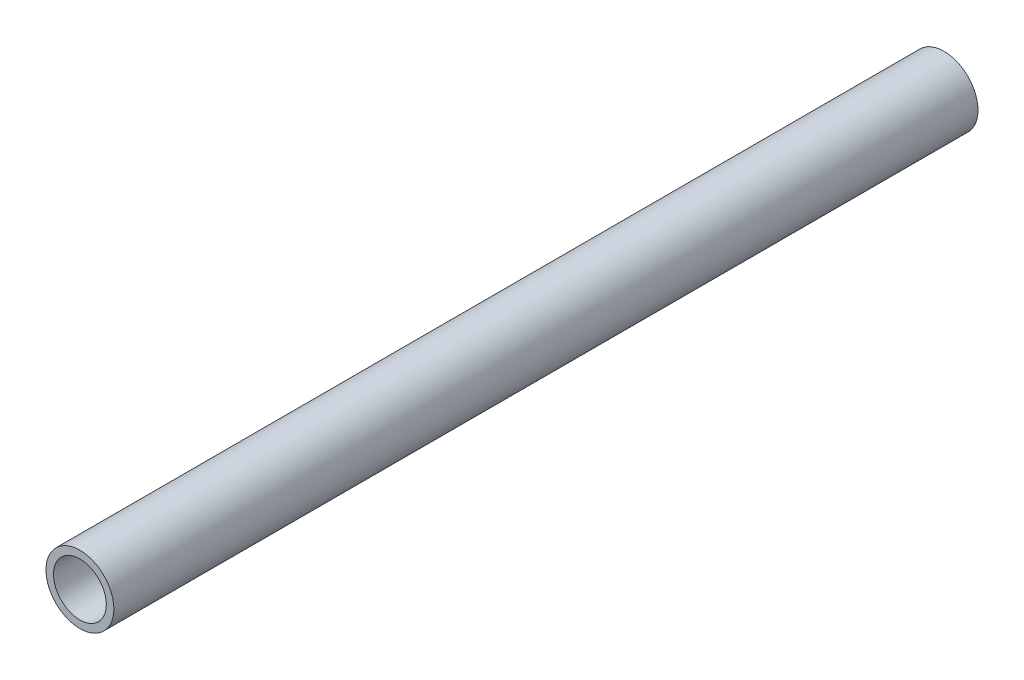
ISO-10303-21;
HEADER;
FILE_DESCRIPTION(('STEP AP214'),'2;1');
FILE_NAME('part.step','',(''),(''),'','','');
FILE_SCHEMA(('AUTOMOTIVE_DESIGN { 1 0 10303 214 1 1 1 1 }'));
ENDSEC;
DATA;
#1=APPLICATION_CONTEXT('core data for automotive mechanical design processes');
#2=APPLICATION_PROTOCOL_DEFINITION('international standard','automotive_design',2000,#1);
#3=PRODUCT_CONTEXT('',#1,'mechanical');
#4=PRODUCT('Part','Part','',(#3));
#5=PRODUCT_RELATED_PRODUCT_CATEGORY('part','',(#4));
#6=PRODUCT_DEFINITION_FORMATION('','',#4);
#7=PRODUCT_DEFINITION_CONTEXT('part definition',#1,'design');
#8=PRODUCT_DEFINITION('design','',#6,#7);
#9=PRODUCT_DEFINITION_SHAPE('','',#8);
#10=(LENGTH_UNIT() NAMED_UNIT(*) SI_UNIT(.MILLI.,.METRE.));
#11=(NAMED_UNIT(*) PLANE_ANGLE_UNIT() SI_UNIT($,.RADIAN.));
#12=(NAMED_UNIT(*) SI_UNIT($,.STERADIAN.) SOLID_ANGLE_UNIT());
#13=UNCERTAINTY_MEASURE_WITH_UNIT(LENGTH_MEASURE(1.E-05),#10,'distance_accuracy_value','');
#14=(GEOMETRIC_REPRESENTATION_CONTEXT(3) GLOBAL_UNCERTAINTY_ASSIGNED_CONTEXT((#13)) GLOBAL_UNIT_ASSIGNED_CONTEXT((#10,
#11,#12)) REPRESENTATION_CONTEXT('',''));
#15=CARTESIAN_POINT('',(0.,0.,0.));
#16=DIRECTION('',(0.,0.,1.));
#17=DIRECTION('',(1.,0.,0.));
#18=AXIS2_PLACEMENT_3D('',#15,#16,#17);
#19=CARTESIAN_POINT('',(0.,0.,229.04));
#20=DIRECTION('',(0.,0.,1.));
#21=DIRECTION('',(1.,0.,0.));
#22=AXIS2_PLACEMENT_3D('',#19,#20,#21);
#23=PLANE('',#22);
#24=CARTESIAN_POINT('',(0.,0.,229.04));
#25=DIRECTION('',(0.,0.,1.));
#26=DIRECTION('',(1.,0.,0.));
#27=AXIS2_PLACEMENT_3D('',#24,#25,#26);
#28=CIRCLE('',#27,9.);
#29=CARTESIAN_POINT('',(9.,0.,229.04));
#30=VERTEX_POINT('',#29);
#31=EDGE_CURVE('E10',#30,#30,#28,.T.);
#32=ORIENTED_EDGE('',*,*,#31,.T.);
#33=EDGE_LOOP('',(#32));
#34=FACE_BOUND('',#33,.T.);
#35=CARTESIAN_POINT('',(0.,0.,229.04));
#36=DIRECTION('',(0.,0.,1.));
#37=DIRECTION('',(1.,0.,0.));
#38=AXIS2_PLACEMENT_3D('',#35,#36,#37);
#39=CIRCLE('',#38,7.);
#40=CARTESIAN_POINT('',(7.,0.,229.04));
#41=VERTEX_POINT('',#40);
#42=EDGE_CURVE('E44',#41,#41,#39,.T.);
#43=ORIENTED_EDGE('',*,*,#42,.F.);
#44=EDGE_LOOP('',(#43));
#45=FACE_BOUND('',#44,.T.);
#46=ADVANCED_FACE('F33',(#34,#45),#23,.T.);
#47=CARTESIAN_POINT('',(0.,0.,0.));
#48=DIRECTION('',(0.,0.,1.));
#49=DIRECTION('',(1.,0.,0.));
#50=AXIS2_PLACEMENT_3D('',#47,#48,#49);
#51=PLANE('',#50);
#52=CARTESIAN_POINT('',(0.,0.,0.));
#53=DIRECTION('',(0.,0.,1.));
#54=DIRECTION('',(1.,0.,0.));
#55=AXIS2_PLACEMENT_3D('',#52,#53,#54);
#56=CIRCLE('',#55,9.);
#57=CARTESIAN_POINT('',(9.,0.,0.));
#58=VERTEX_POINT('',#57);
#59=EDGE_CURVE('E37',#58,#58,#56,.T.);
#60=ORIENTED_EDGE('',*,*,#59,.F.);
#61=EDGE_LOOP('',(#60));
#62=FACE_BOUND('',#61,.T.);
#63=CARTESIAN_POINT('',(0.,0.,0.));
#64=DIRECTION('',(0.,0.,1.));
#65=DIRECTION('',(1.,0.,0.));
#66=AXIS2_PLACEMENT_3D('',#63,#64,#65);
#67=CIRCLE('',#66,7.);
#68=CARTESIAN_POINT('',(7.,0.,0.));
#69=VERTEX_POINT('',#68);
#70=EDGE_CURVE('E46',#69,#69,#67,.T.);
#71=ORIENTED_EDGE('',*,*,#70,.T.);
#72=EDGE_LOOP('',(#71));
#73=FACE_BOUND('',#72,.T.);
#74=ADVANCED_FACE('F56',(#62,#73),#51,.F.);
#75=CARTESIAN_POINT('',(0.,0.,229.04));
#76=DIRECTION('',(0.,0.,-1.));
#77=DIRECTION('',(-1.,0.,0.));
#78=AXIS2_PLACEMENT_3D('',#75,#76,#77);
#79=CYLINDRICAL_SURFACE('',#78,9.);
#80=ORIENTED_EDGE('',*,*,#31,.F.);
#81=EDGE_LOOP('',(#80));
#82=FACE_BOUND('',#81,.T.);
#83=ORIENTED_EDGE('',*,*,#59,.T.);
#84=EDGE_LOOP('',(#83));
#85=FACE_BOUND('',#84,.T.);
#86=ADVANCED_FACE('F35',(#82,#85),#79,.T.);
#87=CARTESIAN_POINT('',(0.,0.,229.04));
#88=DIRECTION('',(0.,0.,-1.));
#89=DIRECTION('',(-1.,0.,0.));
#90=AXIS2_PLACEMENT_3D('',#87,#88,#89);
#91=CYLINDRICAL_SURFACE('',#90,7.);
#92=ORIENTED_EDGE('',*,*,#42,.T.);
#93=EDGE_LOOP('',(#92));
#94=FACE_BOUND('',#93,.T.);
#95=ORIENTED_EDGE('',*,*,#70,.F.);
#96=EDGE_LOOP('',(#95));
#97=FACE_BOUND('',#96,.T.);
#98=ADVANCED_FACE('F52',(#94,#97),#91,.F.);
#99=CLOSED_SHELL('',(#46,#74,#86,#98));
#100=MANIFOLD_SOLID_BREP('B2',#99);
#101=ADVANCED_BREP_SHAPE_REPRESENTATION('',(#18,#100),#14);
#102=SHAPE_DEFINITION_REPRESENTATION(#9,#101);
ENDSEC;
END-ISO-10303-21;
